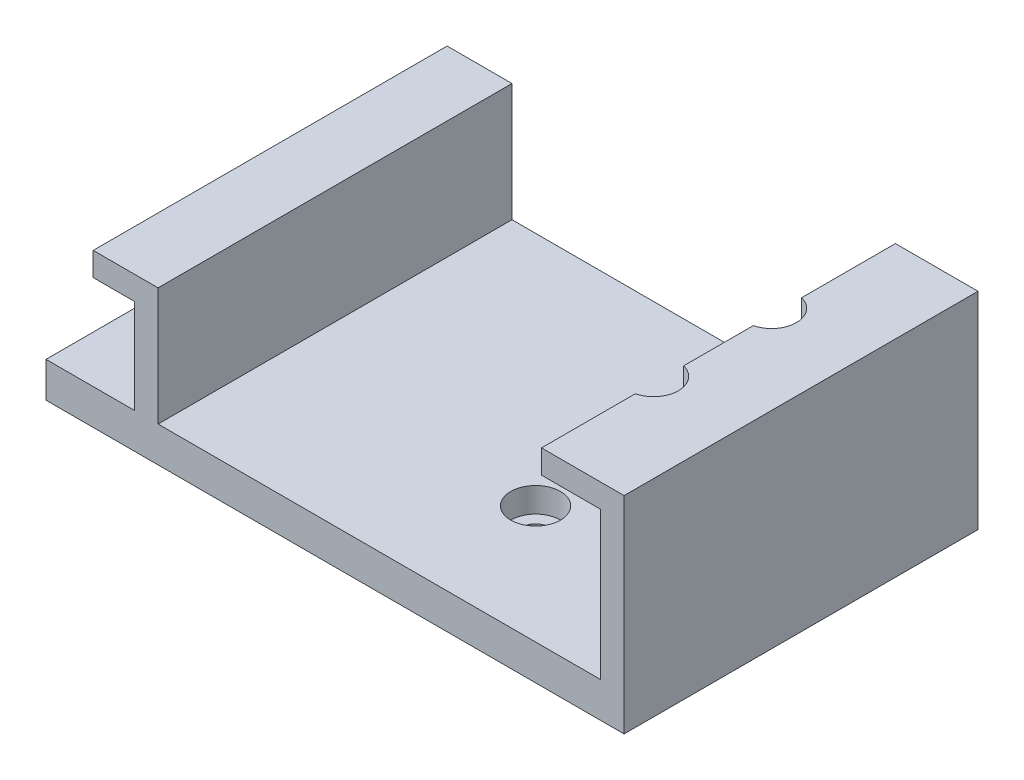
ISO-10303-21;
HEADER;
FILE_DESCRIPTION(('STEP AP214'),'2;1');
FILE_NAME('part.step','',(''),(''),'','','');
FILE_SCHEMA(('AUTOMOTIVE_DESIGN { 1 0 10303 214 1 1 1 1 }'));
ENDSEC;
DATA;
#1=APPLICATION_CONTEXT('core data for automotive mechanical design processes');
#2=APPLICATION_PROTOCOL_DEFINITION('international standard','automotive_design',2000,#1);
#3=PRODUCT_CONTEXT('',#1,'mechanical');
#4=PRODUCT('Part','Part','',(#3));
#5=PRODUCT_RELATED_PRODUCT_CATEGORY('part','',(#4));
#6=PRODUCT_DEFINITION_FORMATION('','',#4);
#7=PRODUCT_DEFINITION_CONTEXT('part definition',#1,'design');
#8=PRODUCT_DEFINITION('design','',#6,#7);
#9=PRODUCT_DEFINITION_SHAPE('','',#8);
#10=(LENGTH_UNIT() NAMED_UNIT(*) SI_UNIT(.MILLI.,.METRE.));
#11=(NAMED_UNIT(*) PLANE_ANGLE_UNIT() SI_UNIT($,.RADIAN.));
#12=(NAMED_UNIT(*) SI_UNIT($,.STERADIAN.) SOLID_ANGLE_UNIT());
#13=UNCERTAINTY_MEASURE_WITH_UNIT(LENGTH_MEASURE(1.E-05),#10,'distance_accuracy_value','');
#14=(GEOMETRIC_REPRESENTATION_CONTEXT(3) GLOBAL_UNCERTAINTY_ASSIGNED_CONTEXT((#13)) GLOBAL_UNIT_ASSIGNED_CONTEXT((#10,
#11,#12)) REPRESENTATION_CONTEXT('',''));
#15=CARTESIAN_POINT('',(0.,0.,0.));
#16=DIRECTION('',(0.,0.,1.));
#17=DIRECTION('',(1.,0.,0.));
#18=AXIS2_PLACEMENT_3D('',#15,#16,#17);
#19=CARTESIAN_POINT('',(-14.,-4.,30.));
#20=DIRECTION('',(1.,0.,0.));
#21=DIRECTION('',(0.,0.,-1.));
#22=AXIS2_PLACEMENT_3D('',#19,#20,#21);
#23=PLANE('',#22);
#24=DIRECTION('',(0.,-1.,0.));
#25=VECTOR('',#24,1.);
#26=CARTESIAN_POINT('',(-14.,11.,14.0946581053856));
#27=LINE('',#26,#25);
#28=CARTESIAN_POINT('',(-14.,-4.,14.0946581053856));
#29=VERTEX_POINT('',#28);
#30=CARTESIAN_POINT('',(-14.,0.,14.0946581053856));
#31=VERTEX_POINT('',#30);
#32=EDGE_CURVE('E432',#29,#31,#27,.F.);
#33=ORIENTED_EDGE('',*,*,#32,.F.);
#34=DIRECTION('',(0.,0.,-1.));
#35=VECTOR('',#34,1.);
#36=CARTESIAN_POINT('',(-14.,-4.,30.));
#37=LINE('',#36,#35);
#38=CARTESIAN_POINT('',(-14.,-4.,30.));
#39=VERTEX_POINT('',#38);
#40=EDGE_CURVE('E206',#39,#29,#37,.T.);
#41=ORIENTED_EDGE('',*,*,#40,.F.);
#42=DIRECTION('',(0.,-1.,0.));
#43=VECTOR('',#42,1.);
#44=CARTESIAN_POINT('',(-14.,-4.,30.));
#45=LINE('',#44,#43);
#46=CARTESIAN_POINT('',(-14.,0.,30.));
#47=VERTEX_POINT('',#46);
#48=EDGE_CURVE('E393',#47,#39,#45,.T.);
#49=ORIENTED_EDGE('',*,*,#48,.F.);
#50=DIRECTION('',(0.,0.,-1.));
#51=VECTOR('',#50,1.);
#52=CARTESIAN_POINT('',(-14.,0.,30.));
#53=LINE('',#52,#51);
#54=EDGE_CURVE('E226',#47,#31,#53,.T.);
#55=ORIENTED_EDGE('',*,*,#54,.T.);
#56=EDGE_LOOP('',(#33,#41,#49,#55));
#57=FACE_BOUND('',#56,.T.);
#58=ADVANCED_FACE('F33',(#57),#23,.F.);
#59=DIRECTION('',(0.,-1.,0.));
#60=VECTOR('',#59,1.);
#61=CARTESIAN_POINT('',(-14.,11.,5.90534189461441));
#62=LINE('',#61,#60);
#63=CARTESIAN_POINT('',(-14.,0.,5.90534189461441));
#64=VERTEX_POINT('',#63);
#65=CARTESIAN_POINT('',(-14.,-4.,5.90534189461441));
#66=VERTEX_POINT('',#65);
#67=EDGE_CURVE('E477',#64,#66,#62,.T.);
#68=ORIENTED_EDGE('',*,*,#67,.F.);
#69=CARTESIAN_POINT('',(-14.,0.,-5.90534189461441));
#70=VERTEX_POINT('',#69);
#71=EDGE_CURVE('E223',#64,#70,#53,.T.);
#72=ORIENTED_EDGE('',*,*,#71,.T.);
#73=DIRECTION('',(0.,-1.,0.));
#74=VECTOR('',#73,1.);
#75=CARTESIAN_POINT('',(-14.,11.,-5.90534189461441));
#76=LINE('',#75,#74);
#77=CARTESIAN_POINT('',(-14.,-4.,-5.90534189461441));
#78=VERTEX_POINT('',#77);
#79=EDGE_CURVE('E200',#78,#70,#76,.F.);
#80=ORIENTED_EDGE('',*,*,#79,.F.);
#81=EDGE_CURVE('E276',#66,#78,#37,.T.);
#82=ORIENTED_EDGE('',*,*,#81,.F.);
#83=EDGE_LOOP('',(#68,#72,#80,#82));
#84=FACE_BOUND('',#83,.T.);
#85=ADVANCED_FACE('F476',(#84),#23,.F.);
#86=DIRECTION('',(0.,-1.,0.));
#87=VECTOR('',#86,1.);
#88=CARTESIAN_POINT('',(-14.,11.,-14.0946581053856));
#89=LINE('',#88,#87);
#90=CARTESIAN_POINT('',(-14.,0.,-14.0946581053856));
#91=VERTEX_POINT('',#90);
#92=CARTESIAN_POINT('',(-14.,-4.,-14.0946581053856));
#93=VERTEX_POINT('',#92);
#94=EDGE_CURVE('E197',#91,#93,#89,.T.);
#95=ORIENTED_EDGE('',*,*,#94,.F.);
#96=CARTESIAN_POINT('',(-14.,0.,-30.));
#97=VERTEX_POINT('',#96);
#98=EDGE_CURVE('E212',#91,#97,#53,.T.);
#99=ORIENTED_EDGE('',*,*,#98,.T.);
#100=DIRECTION('',(0.,-1.,0.));
#101=VECTOR('',#100,1.);
#102=CARTESIAN_POINT('',(-14.,-4.,-30.));
#103=LINE('',#102,#101);
#104=CARTESIAN_POINT('',(-14.,-4.,-30.));
#105=VERTEX_POINT('',#104);
#106=EDGE_CURVE('E290',#97,#105,#103,.T.);
#107=ORIENTED_EDGE('',*,*,#106,.T.);
#108=EDGE_CURVE('E214',#93,#105,#37,.T.);
#109=ORIENTED_EDGE('',*,*,#108,.F.);
#110=EDGE_LOOP('',(#95,#99,#107,#109));
#111=FACE_BOUND('',#110,.T.);
#112=ADVANCED_FACE('F210',(#111),#23,.F.);
#113=CARTESIAN_POINT('',(-15.,-39.,10.));
#114=DIRECTION('',(0.,1.,0.));
#115=DIRECTION('',(0.,0.,1.));
#116=AXIS2_PLACEMENT_3D('',#113,#114,#115);
#117=CYLINDRICAL_SURFACE('',#116,2.2);
#118=CARTESIAN_POINT('',(-15.,-35.,10.));
#119=DIRECTION('',(0.,1.,0.));
#120=DIRECTION('',(-1.,0.,0.));
#121=AXIS2_PLACEMENT_3D('',#118,#119,#120);
#122=CIRCLE('',#121,2.2);
#123=CARTESIAN_POINT('',(-17.2,-35.,10.));
#124=VERTEX_POINT('',#123);
#125=EDGE_CURVE('E277',#124,#124,#122,.T.);
#126=ORIENTED_EDGE('',*,*,#125,.F.);
#127=EDGE_LOOP('',(#126));
#128=FACE_BOUND('',#127,.T.);
#129=CARTESIAN_POINT('',(-15.,-33.2,10.));
#130=DIRECTION('',(0.,1.,0.));
#131=DIRECTION('',(0.,0.,1.));
#132=AXIS2_PLACEMENT_3D('',#129,#130,#131);
#133=CIRCLE('',#132,2.2);
#134=CARTESIAN_POINT('',(-15.,-33.2,12.2));
#135=VERTEX_POINT('',#134);
#136=EDGE_CURVE('E215',#135,#135,#133,.F.);
#137=ORIENTED_EDGE('',*,*,#136,.F.);
#138=EDGE_LOOP('',(#137));
#139=FACE_BOUND('',#138,.T.);
#140=ADVANCED_FACE('F526',(#128,#139),#117,.F.);
#141=CARTESIAN_POINT('',(-15.,-39.,-10.));
#142=DIRECTION('',(0.,1.,0.));
#143=DIRECTION('',(0.,0.,1.));
#144=AXIS2_PLACEMENT_3D('',#141,#142,#143);
#145=CYLINDRICAL_SURFACE('',#144,2.2);
#146=CARTESIAN_POINT('',(-15.,-35.,-10.));
#147=DIRECTION('',(0.,1.,0.));
#148=DIRECTION('',(-1.,0.,0.));
#149=AXIS2_PLACEMENT_3D('',#146,#147,#148);
#150=CIRCLE('',#149,2.2);
#151=CARTESIAN_POINT('',(-17.2,-35.,-10.));
#152=VERTEX_POINT('',#151);
#153=EDGE_CURVE('E280',#152,#152,#150,.T.);
#154=ORIENTED_EDGE('',*,*,#153,.F.);
#155=EDGE_LOOP('',(#154));
#156=FACE_BOUND('',#155,.T.);
#157=CARTESIAN_POINT('',(-15.,-33.2,-10.));
#158=DIRECTION('',(0.,1.,0.));
#159=DIRECTION('',(0.,0.,1.));
#160=AXIS2_PLACEMENT_3D('',#157,#158,#159);
#161=CIRCLE('',#160,2.2);
#162=CARTESIAN_POINT('',(-15.,-33.2,-7.8));
#163=VERTEX_POINT('',#162);
#164=EDGE_CURVE('E298',#163,#163,#161,.F.);
#165=ORIENTED_EDGE('',*,*,#164,.F.);
#166=EDGE_LOOP('',(#165));
#167=FACE_BOUND('',#166,.T.);
#168=ADVANCED_FACE('F530',(#156,#167),#145,.F.);
#169=CARTESIAN_POINT('',(-35.,-39.,-10.));
#170=DIRECTION('',(0.,1.,0.));
#171=DIRECTION('',(0.,0.,1.));
#172=AXIS2_PLACEMENT_3D('',#169,#170,#171);
#173=CYLINDRICAL_SURFACE('',#172,2.2);
#174=CARTESIAN_POINT('',(-35.,-35.,-10.));
#175=DIRECTION('',(0.,1.,0.));
#176=DIRECTION('',(-1.,0.,0.));
#177=AXIS2_PLACEMENT_3D('',#174,#175,#176);
#178=CIRCLE('',#177,2.2);
#179=CARTESIAN_POINT('',(-37.2,-35.,-10.));
#180=VERTEX_POINT('',#179);
#181=EDGE_CURVE('E284',#180,#180,#178,.T.);
#182=ORIENTED_EDGE('',*,*,#181,.F.);
#183=EDGE_LOOP('',(#182));
#184=FACE_BOUND('',#183,.T.);
#185=CARTESIAN_POINT('',(-35.,-33.2,-10.));
#186=DIRECTION('',(0.,1.,0.));
#187=DIRECTION('',(0.,0.,1.));
#188=AXIS2_PLACEMENT_3D('',#185,#186,#187);
#189=CIRCLE('',#188,2.2);
#190=CARTESIAN_POINT('',(-35.,-33.2,-7.80000000000001));
#191=VERTEX_POINT('',#190);
#192=EDGE_CURVE('E294',#191,#191,#189,.F.);
#193=ORIENTED_EDGE('',*,*,#192,.F.);
#194=EDGE_LOOP('',(#193));
#195=FACE_BOUND('',#194,.T.);
#196=ADVANCED_FACE('F536',(#184,#195),#173,.F.);
#197=CARTESIAN_POINT('',(-35.,-39.,10.));
#198=DIRECTION('',(0.,1.,0.));
#199=DIRECTION('',(0.,0.,1.));
#200=AXIS2_PLACEMENT_3D('',#197,#198,#199);
#201=CYLINDRICAL_SURFACE('',#200,2.2);
#202=CARTESIAN_POINT('',(-35.,-35.,10.));
#203=DIRECTION('',(0.,1.,0.));
#204=DIRECTION('',(-1.,0.,0.));
#205=AXIS2_PLACEMENT_3D('',#202,#203,#204);
#206=CIRCLE('',#205,2.2);
#207=CARTESIAN_POINT('',(-37.2,-35.,10.));
#208=VERTEX_POINT('',#207);
#209=EDGE_CURVE('E287',#208,#208,#206,.T.);
#210=ORIENTED_EDGE('',*,*,#209,.F.);
#211=EDGE_LOOP('',(#210));
#212=FACE_BOUND('',#211,.T.);
#213=CARTESIAN_POINT('',(-35.,-33.2,10.));
#214=DIRECTION('',(0.,1.,0.));
#215=DIRECTION('',(0.,0.,1.));
#216=AXIS2_PLACEMENT_3D('',#213,#214,#215);
#217=CIRCLE('',#216,2.2);
#218=CARTESIAN_POINT('',(-35.,-33.2,12.2));
#219=VERTEX_POINT('',#218);
#220=EDGE_CURVE('E291',#219,#219,#217,.F.);
#221=ORIENTED_EDGE('',*,*,#220,.F.);
#222=EDGE_LOOP('',(#221));
#223=FACE_BOUND('',#222,.T.);
#224=ADVANCED_FACE('F542',(#212,#223),#201,.F.);
#225=CARTESIAN_POINT('',(-4.,-4.,30.));
#226=DIRECTION('',(0.,1.,0.));
#227=DIRECTION('',(-1.,0.,0.));
#228=AXIS2_PLACEMENT_3D('',#225,#226,#227);
#229=PLANE('',#228);
#230=CARTESIAN_POINT('',(-15.,-4.,10.));
#231=DIRECTION('',(0.,1.,0.));
#232=DIRECTION('',(-1.,0.,0.));
#233=AXIS2_PLACEMENT_3D('',#230,#231,#232);
#234=CIRCLE('',#233,4.215);
#235=EDGE_CURVE('E437',#66,#29,#234,.F.);
#236=ORIENTED_EDGE('',*,*,#235,.F.);
#237=ORIENTED_EDGE('',*,*,#81,.T.);
#238=CARTESIAN_POINT('',(-15.,-4.,-10.));
#239=DIRECTION('',(0.,1.,0.));
#240=DIRECTION('',(-1.,0.,0.));
#241=AXIS2_PLACEMENT_3D('',#238,#239,#240);
#242=CIRCLE('',#241,4.215);
#243=EDGE_CURVE('E473',#93,#78,#242,.F.);
#244=ORIENTED_EDGE('',*,*,#243,.F.);
#245=ORIENTED_EDGE('',*,*,#108,.T.);
#246=DIRECTION('',(1.,0.,0.));
#247=VECTOR('',#246,1.);
#248=CARTESIAN_POINT('',(-4.,-4.,-30.));
#249=LINE('',#248,#247);
#250=CARTESIAN_POINT('',(-4.,-4.,-30.));
#251=VERTEX_POINT('',#250);
#252=EDGE_CURVE('E369',#105,#251,#249,.T.);
#253=ORIENTED_EDGE('',*,*,#252,.T.);
#254=DIRECTION('',(0.,0.,-1.));
#255=VECTOR('',#254,1.);
#256=CARTESIAN_POINT('',(-4.,-4.,30.));
#257=LINE('',#256,#255);
#258=CARTESIAN_POINT('',(-4.,-4.,30.));
#259=VERTEX_POINT('',#258);
#260=EDGE_CURVE('E271',#259,#251,#257,.T.);
#261=ORIENTED_EDGE('',*,*,#260,.F.);
#262=DIRECTION('',(1.,0.,0.));
#263=VECTOR('',#262,1.);
#264=CARTESIAN_POINT('',(-4.,-4.,30.));
#265=LINE('',#264,#263);
#266=EDGE_CURVE('E395',#39,#259,#265,.T.);
#267=ORIENTED_EDGE('',*,*,#266,.F.);
#268=ORIENTED_EDGE('',*,*,#40,.T.);
#269=EDGE_LOOP('',(#236,#237,#244,#245,#253,#261,#267,#268));
#270=FACE_BOUND('',#269,.T.);
#271=ADVANCED_FACE('F435',(#270),#229,.F.);
#272=CARTESIAN_POINT('',(-4.,-29.,30.));
#273=DIRECTION('',(1.,0.,0.));
#274=DIRECTION('',(0.,0.,-1.));
#275=AXIS2_PLACEMENT_3D('',#272,#273,#274);
#276=PLANE('',#275);
#277=DIRECTION('',(0.,-1.,0.));
#278=VECTOR('',#277,1.);
#279=CARTESIAN_POINT('',(-4.,-29.,-30.));
#280=LINE('',#279,#278);
#281=CARTESIAN_POINT('',(-4.,-29.,-30.));
#282=VERTEX_POINT('',#281);
#283=EDGE_CURVE('E371',#251,#282,#280,.T.);
#284=ORIENTED_EDGE('',*,*,#283,.T.);
#285=DIRECTION('',(0.,0.,-1.));
#286=VECTOR('',#285,1.);
#287=CARTESIAN_POINT('',(-4.,-29.,30.));
#288=LINE('',#287,#286);
#289=CARTESIAN_POINT('',(-4.,-29.,30.));
#290=VERTEX_POINT('',#289);
#291=EDGE_CURVE('E268',#290,#282,#288,.T.);
#292=ORIENTED_EDGE('',*,*,#291,.F.);
#293=DIRECTION('',(0.,-1.,0.));
#294=VECTOR('',#293,1.);
#295=CARTESIAN_POINT('',(-4.,-29.,30.));
#296=LINE('',#295,#294);
#297=EDGE_CURVE('E398',#259,#290,#296,.T.);
#298=ORIENTED_EDGE('',*,*,#297,.F.);
#299=ORIENTED_EDGE('',*,*,#260,.T.);
#300=EDGE_LOOP('',(#284,#292,#298,#299));
#301=FACE_BOUND('',#300,.T.);
#302=ADVANCED_FACE('F445',(#301),#276,.F.);
#303=CARTESIAN_POINT('',(-79.,-29.,30.));
#304=DIRECTION('',(0.,-1.,0.));
#305=DIRECTION('',(1.,0.,0.));
#306=AXIS2_PLACEMENT_3D('',#303,#304,#305);
#307=PLANE('',#306);
#308=CARTESIAN_POINT('',(-35.,-29.,10.));
#309=DIRECTION('',(0.,-1.,0.));
#310=DIRECTION('',(1.,0.,0.));
#311=AXIS2_PLACEMENT_3D('',#308,#309,#310);
#312=CIRCLE('',#311,4.215);
#313=CARTESIAN_POINT('',(-30.785,-29.,10.));
#314=VERTEX_POINT('',#313);
#315=EDGE_CURVE('E281',#314,#314,#312,.F.);
#316=ORIENTED_EDGE('',*,*,#315,.F.);
#317=EDGE_LOOP('',(#316));
#318=FACE_BOUND('',#317,.T.);
#319=CARTESIAN_POINT('',(-15.,-29.,10.));
#320=DIRECTION('',(0.,-1.,0.));
#321=DIRECTION('',(1.,0.,0.));
#322=AXIS2_PLACEMENT_3D('',#319,#320,#321);
#323=CIRCLE('',#322,4.215);
#324=CARTESIAN_POINT('',(-10.785,-29.,10.));
#325=VERTEX_POINT('',#324);
#326=EDGE_CURVE('E308',#325,#325,#323,.F.);
#327=ORIENTED_EDGE('',*,*,#326,.F.);
#328=EDGE_LOOP('',(#327));
#329=FACE_BOUND('',#328,.T.);
#330=CARTESIAN_POINT('',(-15.,-29.,-10.));
#331=DIRECTION('',(0.,-1.,0.));
#332=DIRECTION('',(1.,0.,0.));
#333=AXIS2_PLACEMENT_3D('',#330,#331,#332);
#334=CIRCLE('',#333,4.215);
#335=CARTESIAN_POINT('',(-10.785,-29.,-10.));
#336=VERTEX_POINT('',#335);
#337=EDGE_CURVE('E479',#336,#336,#334,.F.);
#338=ORIENTED_EDGE('',*,*,#337,.F.);
#339=EDGE_LOOP('',(#338));
#340=FACE_BOUND('',#339,.T.);
#341=CARTESIAN_POINT('',(-35.,-29.,-10.));
#342=DIRECTION('',(0.,-1.,0.));
#343=DIRECTION('',(1.,0.,0.));
#344=AXIS2_PLACEMENT_3D('',#341,#342,#343);
#345=CIRCLE('',#344,4.215);
#346=CARTESIAN_POINT('',(-30.785,-29.,-10.));
#347=VERTEX_POINT('',#346);
#348=EDGE_CURVE('E305',#347,#347,#345,.F.);
#349=ORIENTED_EDGE('',*,*,#348,.F.);
#350=EDGE_LOOP('',(#349));
#351=FACE_BOUND('',#350,.T.);
#352=DIRECTION('',(-1.,0.,0.));
#353=VECTOR('',#352,1.);
#354=CARTESIAN_POINT('',(-79.,-29.,-30.));
#355=LINE('',#354,#353);
#356=CARTESIAN_POINT('',(-79.,-29.,-30.));
#357=VERTEX_POINT('',#356);
#358=EDGE_CURVE('E373',#282,#357,#355,.T.);
#359=ORIENTED_EDGE('',*,*,#358,.T.);
#360=DIRECTION('',(0.,0.,-1.));
#361=VECTOR('',#360,1.);
#362=CARTESIAN_POINT('',(-79.,-29.,30.));
#363=LINE('',#362,#361);
#364=CARTESIAN_POINT('',(-79.,-29.,30.));
#365=VERTEX_POINT('',#364);
#366=EDGE_CURVE('E265',#365,#357,#363,.T.);
#367=ORIENTED_EDGE('',*,*,#366,.F.);
#368=DIRECTION('',(-1.,0.,0.));
#369=VECTOR('',#368,1.);
#370=CARTESIAN_POINT('',(-79.,-29.,30.));
#371=LINE('',#370,#369);
#372=EDGE_CURVE('E404',#290,#365,#371,.T.);
#373=ORIENTED_EDGE('',*,*,#372,.F.);
#374=ORIENTED_EDGE('',*,*,#291,.T.);
#375=EDGE_LOOP('',(#359,#367,#373,#374));
#376=FACE_BOUND('',#375,.T.);
#377=ADVANCED_FACE('F449',(#318,#329,#340,#351,#376),#307,.F.);
#378=CARTESIAN_POINT('',(-79.,-9.00000000000002,30.));
#379=DIRECTION('',(-1.,0.,0.));
#380=DIRECTION('',(0.,0.,1.));
#381=AXIS2_PLACEMENT_3D('',#378,#379,#380);
#382=PLANE('',#381);
#383=DIRECTION('',(0.,1.,0.));
#384=VECTOR('',#383,1.);
#385=CARTESIAN_POINT('',(-79.,-9.00000000000002,-30.));
#386=LINE('',#385,#384);
#387=CARTESIAN_POINT('',(-79.,-9.00000000000002,-30.));
#388=VERTEX_POINT('',#387);
#389=EDGE_CURVE('E375',#357,#388,#386,.T.);
#390=ORIENTED_EDGE('',*,*,#389,.T.);
#391=DIRECTION('',(0.,0.,-1.));
#392=VECTOR('',#391,1.);
#393=CARTESIAN_POINT('',(-79.,-9.00000000000002,30.));
#394=LINE('',#393,#392);
#395=CARTESIAN_POINT('',(-79.,-9.00000000000002,30.));
#396=VERTEX_POINT('',#395);
#397=EDGE_CURVE('E262',#396,#388,#394,.T.);
#398=ORIENTED_EDGE('',*,*,#397,.F.);
#399=DIRECTION('',(0.,1.,0.));
#400=VECTOR('',#399,1.);
#401=CARTESIAN_POINT('',(-79.,-9.00000000000002,30.));
#402=LINE('',#401,#400);
#403=EDGE_CURVE('E406',#365,#396,#402,.T.);
#404=ORIENTED_EDGE('',*,*,#403,.F.);
#405=ORIENTED_EDGE('',*,*,#366,.T.);
#406=EDGE_LOOP('',(#390,#398,#404,#405));
#407=FACE_BOUND('',#406,.T.);
#408=ADVANCED_FACE('F454',(#407),#382,.F.);
#409=CARTESIAN_POINT('',(-90.,-9.00000000000002,30.));
#410=DIRECTION('',(0.,-1.,0.));
#411=DIRECTION('',(0.,0.,-1.));
#412=AXIS2_PLACEMENT_3D('',#409,#410,#411);
#413=PLANE('',#412);
#414=DIRECTION('',(-1.,0.,0.));
#415=VECTOR('',#414,1.);
#416=CARTESIAN_POINT('',(-90.,-9.00000000000002,-30.));
#417=LINE('',#416,#415);
#418=CARTESIAN_POINT('',(-90.,-9.00000000000002,-30.));
#419=VERTEX_POINT('',#418);
#420=EDGE_CURVE('E377',#388,#419,#417,.T.);
#421=ORIENTED_EDGE('',*,*,#420,.T.);
#422=DIRECTION('',(0.,0.,-1.));
#423=VECTOR('',#422,1.);
#424=CARTESIAN_POINT('',(-90.,-9.00000000000002,30.));
#425=LINE('',#424,#423);
#426=CARTESIAN_POINT('',(-90.,-9.00000000000002,30.));
#427=VERTEX_POINT('',#426);
#428=EDGE_CURVE('E259',#427,#419,#425,.T.);
#429=ORIENTED_EDGE('',*,*,#428,.F.);
#430=DIRECTION('',(-1.,0.,0.));
#431=VECTOR('',#430,1.);
#432=CARTESIAN_POINT('',(-90.,-9.00000000000002,30.));
#433=LINE('',#432,#431);
#434=EDGE_CURVE('E408',#396,#427,#433,.T.);
#435=ORIENTED_EDGE('',*,*,#434,.F.);
#436=ORIENTED_EDGE('',*,*,#397,.T.);
#437=EDGE_LOOP('',(#421,#429,#435,#436));
#438=FACE_BOUND('',#437,.T.);
#439=ADVANCED_FACE('F460',(#438),#413,.F.);
#440=CARTESIAN_POINT('',(-90.,-13.,30.));
#441=DIRECTION('',(1.,0.,0.));
#442=DIRECTION('',(0.,0.,-1.));
#443=AXIS2_PLACEMENT_3D('',#440,#441,#442);
#444=PLANE('',#443);
#445=DIRECTION('',(0.,-1.,0.));
#446=VECTOR('',#445,1.);
#447=CARTESIAN_POINT('',(-90.,-13.,-30.));
#448=LINE('',#447,#446);
#449=CARTESIAN_POINT('',(-90.,-13.,-30.));
#450=VERTEX_POINT('',#449);
#451=EDGE_CURVE('E379',#419,#450,#448,.T.);
#452=ORIENTED_EDGE('',*,*,#451,.T.);
#453=DIRECTION('',(0.,0.,-1.));
#454=VECTOR('',#453,1.);
#455=CARTESIAN_POINT('',(-90.,-13.,30.));
#456=LINE('',#455,#454);
#457=CARTESIAN_POINT('',(-90.,-13.,30.));
#458=VERTEX_POINT('',#457);
#459=EDGE_CURVE('E256',#458,#450,#456,.T.);
#460=ORIENTED_EDGE('',*,*,#459,.F.);
#461=DIRECTION('',(0.,-1.,0.));
#462=VECTOR('',#461,1.);
#463=CARTESIAN_POINT('',(-90.,-13.,30.));
#464=LINE('',#463,#462);
#465=EDGE_CURVE('E410',#427,#458,#464,.T.);
#466=ORIENTED_EDGE('',*,*,#465,.F.);
#467=ORIENTED_EDGE('',*,*,#428,.T.);
#468=EDGE_LOOP('',(#452,#460,#466,#467));
#469=FACE_BOUND('',#468,.T.);
#470=ADVANCED_FACE('F464',(#469),#444,.F.);
#471=CARTESIAN_POINT('',(-83.,-13.,30.));
#472=DIRECTION('',(0.,1.,0.));
#473=DIRECTION('',(-1.,0.,0.));
#474=AXIS2_PLACEMENT_3D('',#471,#472,#473);
#475=PLANE('',#474);
#476=DIRECTION('',(1.,0.,0.));
#477=VECTOR('',#476,1.);
#478=CARTESIAN_POINT('',(-83.,-13.,-30.));
#479=LINE('',#478,#477);
#480=CARTESIAN_POINT('',(-83.,-13.,-30.));
#481=VERTEX_POINT('',#480);
#482=EDGE_CURVE('E381',#450,#481,#479,.T.);
#483=ORIENTED_EDGE('',*,*,#482,.T.);
#484=DIRECTION('',(0.,0.,-1.));
#485=VECTOR('',#484,1.);
#486=CARTESIAN_POINT('',(-83.,-13.,30.));
#487=LINE('',#486,#485);
#488=CARTESIAN_POINT('',(-83.,-13.,30.));
#489=VERTEX_POINT('',#488);
#490=EDGE_CURVE('E253',#489,#481,#487,.T.);
#491=ORIENTED_EDGE('',*,*,#490,.F.);
#492=DIRECTION('',(1.,0.,0.));
#493=VECTOR('',#492,1.);
#494=CARTESIAN_POINT('',(-83.,-13.,30.));
#495=LINE('',#494,#493);
#496=EDGE_CURVE('E412',#458,#489,#495,.T.);
#497=ORIENTED_EDGE('',*,*,#496,.F.);
#498=ORIENTED_EDGE('',*,*,#459,.T.);
#499=EDGE_LOOP('',(#483,#491,#497,#498));
#500=FACE_BOUND('',#499,.T.);
#501=ADVANCED_FACE('F469',(#500),#475,.F.);
#502=CARTESIAN_POINT('',(-83.,-29.,30.));
#503=DIRECTION('',(1.,0.,0.));
#504=DIRECTION('',(0.,0.,-1.));
#505=AXIS2_PLACEMENT_3D('',#502,#503,#504);
#506=PLANE('',#505);
#507=DIRECTION('',(0.,-1.,0.));
#508=VECTOR('',#507,1.);
#509=CARTESIAN_POINT('',(-83.,-29.,-30.));
#510=LINE('',#509,#508);
#511=CARTESIAN_POINT('',(-83.,-29.,-30.));
#512=VERTEX_POINT('',#511);
#513=EDGE_CURVE('E383',#481,#512,#510,.T.);
#514=ORIENTED_EDGE('',*,*,#513,.T.);
#515=DIRECTION('',(0.,0.,-1.));
#516=VECTOR('',#515,1.);
#517=CARTESIAN_POINT('',(-83.,-29.,30.));
#518=LINE('',#517,#516);
#519=CARTESIAN_POINT('',(-83.,-29.,30.));
#520=VERTEX_POINT('',#519);
#521=EDGE_CURVE('E250',#520,#512,#518,.T.);
#522=ORIENTED_EDGE('',*,*,#521,.F.);
#523=DIRECTION('',(0.,-1.,0.));
#524=VECTOR('',#523,1.);
#525=CARTESIAN_POINT('',(-83.,-29.,30.));
#526=LINE('',#525,#524);
#527=EDGE_CURVE('E414',#489,#520,#526,.T.);
#528=ORIENTED_EDGE('',*,*,#527,.F.);
#529=ORIENTED_EDGE('',*,*,#490,.T.);
#530=EDGE_LOOP('',(#514,#522,#528,#529));
#531=FACE_BOUND('',#530,.T.);
#532=ADVANCED_FACE('F471',(#531),#506,.F.);
#533=CARTESIAN_POINT('',(-98.,-29.,30.));
#534=DIRECTION('',(0.,-1.,0.));
#535=DIRECTION('',(1.,0.,0.));
#536=AXIS2_PLACEMENT_3D('',#533,#534,#535);
#537=PLANE('',#536);
#538=DIRECTION('',(-1.,0.,0.));
#539=VECTOR('',#538,1.);
#540=CARTESIAN_POINT('',(-98.,-29.,-30.));
#541=LINE('',#540,#539);
#542=CARTESIAN_POINT('',(-98.,-29.,-30.));
#543=VERTEX_POINT('',#542);
#544=EDGE_CURVE('E385',#512,#543,#541,.T.);
#545=ORIENTED_EDGE('',*,*,#544,.T.);
#546=DIRECTION('',(0.,0.,-1.));
#547=VECTOR('',#546,1.);
#548=CARTESIAN_POINT('',(-98.,-29.,30.));
#549=LINE('',#548,#547);
#550=CARTESIAN_POINT('',(-98.,-29.,30.));
#551=VERTEX_POINT('',#550);
#552=EDGE_CURVE('E247',#551,#543,#549,.T.);
#553=ORIENTED_EDGE('',*,*,#552,.F.);
#554=DIRECTION('',(-1.,0.,0.));
#555=VECTOR('',#554,1.);
#556=CARTESIAN_POINT('',(-98.,-29.,30.));
#557=LINE('',#556,#555);
#558=EDGE_CURVE('E364',#520,#551,#557,.T.);
#559=ORIENTED_EDGE('',*,*,#558,.F.);
#560=ORIENTED_EDGE('',*,*,#521,.T.);
#561=EDGE_LOOP('',(#545,#553,#559,#560));
#562=FACE_BOUND('',#561,.T.);
#563=ADVANCED_FACE('F421',(#562),#537,.F.);
#564=CARTESIAN_POINT('',(-98.,-35.,30.));
#565=DIRECTION('',(1.,0.,0.));
#566=DIRECTION('',(0.,0.,-1.));
#567=AXIS2_PLACEMENT_3D('',#564,#565,#566);
#568=PLANE('',#567);
#569=CARTESIAN_POINT('',(-98.,-35.,17.));
#570=DIRECTION('',(1.,0.,0.));
#571=DIRECTION('',(0.,0.,-1.));
#572=AXIS2_PLACEMENT_3D('',#569,#570,#571);
#573=CIRCLE('',#572,3.);
#574=CARTESIAN_POINT('',(-98.,-32.,17.));
#575=VERTEX_POINT('',#574);
#576=CARTESIAN_POINT('',(-98.,-33.5,19.5980762113533));
#577=VERTEX_POINT('',#576);
#578=EDGE_CURVE('E319',#575,#577,#573,.T.);
#579=ORIENTED_EDGE('',*,*,#578,.T.);
#580=CARTESIAN_POINT('',(-98.,-32.,22.1961524227066));
#581=DIRECTION('',(1.,0.,0.));
#582=DIRECTION('',(0.,0.,-1.));
#583=AXIS2_PLACEMENT_3D('',#580,#581,#582);
#584=CIRCLE('',#583,3.);
#585=CARTESIAN_POINT('',(-98.,-35.,22.1961524227066));
#586=VERTEX_POINT('',#585);
#587=EDGE_CURVE('E329',#577,#586,#584,.F.);
#588=ORIENTED_EDGE('',*,*,#587,.T.);
#589=DIRECTION('',(0.,0.,-1.));
#590=VECTOR('',#589,1.);
#591=CARTESIAN_POINT('',(-98.,-35.,30.));
#592=LINE('',#591,#590);
#593=CARTESIAN_POINT('',(-98.,-35.,30.));
#594=VERTEX_POINT('',#593);
#595=EDGE_CURVE('E244',#594,#586,#592,.T.);
#596=ORIENTED_EDGE('',*,*,#595,.F.);
#597=DIRECTION('',(0.,-1.,0.));
#598=VECTOR('',#597,1.);
#599=CARTESIAN_POINT('',(-98.,-35.,30.));
#600=LINE('',#599,#598);
#601=EDGE_CURVE('E361',#551,#594,#600,.T.);
#602=ORIENTED_EDGE('',*,*,#601,.F.);
#603=ORIENTED_EDGE('',*,*,#552,.T.);
#604=DIRECTION('',(0.,-1.,0.));
#605=VECTOR('',#604,1.);
#606=CARTESIAN_POINT('',(-98.,-35.,-30.));
#607=LINE('',#606,#605);
#608=CARTESIAN_POINT('',(-98.,-35.,-30.));
#609=VERTEX_POINT('',#608);
#610=EDGE_CURVE('E387',#543,#609,#607,.T.);
#611=ORIENTED_EDGE('',*,*,#610,.T.);
#612=CARTESIAN_POINT('',(-98.,-35.,-22.1961524227066));
#613=VERTEX_POINT('',#612);
#614=EDGE_CURVE('E241',#613,#609,#592,.T.);
#615=ORIENTED_EDGE('',*,*,#614,.F.);
#616=CARTESIAN_POINT('',(-98.,-32.,-22.1961524227066));
#617=DIRECTION('',(1.,0.,0.));
#618=DIRECTION('',(0.,0.,-1.));
#619=AXIS2_PLACEMENT_3D('',#616,#617,#618);
#620=CIRCLE('',#619,3.);
#621=CARTESIAN_POINT('',(-98.,-33.5,-19.5980762113533));
#622=VERTEX_POINT('',#621);
#623=EDGE_CURVE('E327',#613,#622,#620,.F.);
#624=ORIENTED_EDGE('',*,*,#623,.T.);
#625=CARTESIAN_POINT('',(-98.,-35.,-17.));
#626=DIRECTION('',(1.,0.,0.));
#627=DIRECTION('',(0.,0.,-1.));
#628=AXIS2_PLACEMENT_3D('',#625,#626,#627);
#629=CIRCLE('',#628,3.);
#630=CARTESIAN_POINT('',(-98.,-32.,-17.));
#631=VERTEX_POINT('',#630);
#632=EDGE_CURVE('E322',#622,#631,#629,.T.);
#633=ORIENTED_EDGE('',*,*,#632,.T.);
#634=DIRECTION('',(0.,0.,-1.));
#635=VECTOR('',#634,1.);
#636=CARTESIAN_POINT('',(-98.,-32.,20.));
#637=LINE('',#636,#635);
#638=EDGE_CURVE('E632',#575,#631,#637,.T.);
#639=ORIENTED_EDGE('',*,*,#638,.F.);
#640=EDGE_LOOP('',(#579,#588,#596,#602,#603,#611,#615,#624,#633,#639));
#641=FACE_BOUND('',#640,.T.);
#642=ADVANCED_FACE('F350',(#641),#568,.F.);
#643=CARTESIAN_POINT('',(0.,-35.,30.));
#644=DIRECTION('',(0.,1.,0.));
#645=DIRECTION('',(-1.,0.,0.));
#646=AXIS2_PLACEMENT_3D('',#643,#644,#645);
#647=PLANE('',#646);
#648=ORIENTED_EDGE('',*,*,#595,.T.);
#649=DIRECTION('',(1.,0.,0.));
#650=VECTOR('',#649,1.);
#651=CARTESIAN_POINT('',(0.,-35.,22.1961524227066));
#652=LINE('',#651,#650);
#653=CARTESIAN_POINT('',(-53.,-35.,22.1961524227066));
#654=VERTEX_POINT('',#653);
#655=EDGE_CURVE('E334',#586,#654,#652,.T.);
#656=ORIENTED_EDGE('',*,*,#655,.T.);
#657=DIRECTION('',(0.,0.,1.));
#658=VECTOR('',#657,1.);
#659=CARTESIAN_POINT('',(-53.,-35.,20.));
#660=LINE('',#659,#658);
#661=CARTESIAN_POINT('',(-53.,-35.,-22.1961524227066));
#662=VERTEX_POINT('',#661);
#663=EDGE_CURVE('E55',#662,#654,#660,.T.);
#664=ORIENTED_EDGE('',*,*,#663,.F.);
#665=DIRECTION('',(1.,0.,0.));
#666=VECTOR('',#665,1.);
#667=CARTESIAN_POINT('',(0.,-35.,-22.1961524227066));
#668=LINE('',#667,#666);
#669=EDGE_CURVE('E331',#662,#613,#668,.F.);
#670=ORIENTED_EDGE('',*,*,#669,.T.);
#671=ORIENTED_EDGE('',*,*,#614,.T.);
#672=DIRECTION('',(1.,0.,0.));
#673=VECTOR('',#672,1.);
#674=CARTESIAN_POINT('',(0.,-35.,-30.));
#675=LINE('',#674,#673);
#676=CARTESIAN_POINT('',(0.,-35.,-30.));
#677=VERTEX_POINT('',#676);
#678=EDGE_CURVE('E390',#609,#677,#675,.T.);
#679=ORIENTED_EDGE('',*,*,#678,.T.);
#680=DIRECTION('',(0.,0.,-1.));
#681=VECTOR('',#680,1.);
#682=CARTESIAN_POINT('',(0.,-35.,30.));
#683=LINE('',#682,#681);
#684=CARTESIAN_POINT('',(0.,-35.,30.));
#685=VERTEX_POINT('',#684);
#686=EDGE_CURVE('E237',#685,#677,#683,.T.);
#687=ORIENTED_EDGE('',*,*,#686,.F.);
#688=DIRECTION('',(1.,0.,0.));
#689=VECTOR('',#688,1.);
#690=CARTESIAN_POINT('',(0.,-35.,30.));
#691=LINE('',#690,#689);
#692=EDGE_CURVE('E358',#594,#685,#691,.T.);
#693=ORIENTED_EDGE('',*,*,#692,.F.);
#694=EDGE_LOOP('',(#648,#656,#664,#670,#671,#679,#687,#693));
#695=FACE_BOUND('',#694,.T.);
#696=ORIENTED_EDGE('',*,*,#209,.T.);
#697=EDGE_LOOP('',(#696));
#698=FACE_BOUND('',#697,.T.);
#699=ORIENTED_EDGE('',*,*,#181,.T.);
#700=EDGE_LOOP('',(#699));
#701=FACE_BOUND('',#700,.T.);
#702=ORIENTED_EDGE('',*,*,#153,.T.);
#703=EDGE_LOOP('',(#702));
#704=FACE_BOUND('',#703,.T.);
#705=ORIENTED_EDGE('',*,*,#125,.T.);
#706=EDGE_LOOP('',(#705));
#707=FACE_BOUND('',#706,.T.);
#708=ADVANCED_FACE('F355',(#695,#698,#701,#704,#707),#647,.F.);
#709=CARTESIAN_POINT('',(0.,0.,30.));
#710=DIRECTION('',(-1.,0.,0.));
#711=DIRECTION('',(0.,-1.,0.));
#712=AXIS2_PLACEMENT_3D('',#709,#710,#711);
#713=PLANE('',#712);
#714=DIRECTION('',(0.,1.,0.));
#715=VECTOR('',#714,1.);
#716=CARTESIAN_POINT('',(0.,0.,-30.));
#717=LINE('',#716,#715);
#718=CARTESIAN_POINT('',(0.,0.,-30.));
#719=VERTEX_POINT('',#718);
#720=EDGE_CURVE('E392',#677,#719,#717,.T.);
#721=ORIENTED_EDGE('',*,*,#720,.T.);
#722=DIRECTION('',(0.,0.,-1.));
#723=VECTOR('',#722,1.);
#724=CARTESIAN_POINT('',(0.,0.,30.));
#725=LINE('',#724,#723);
#726=CARTESIAN_POINT('',(0.,0.,30.));
#727=VERTEX_POINT('',#726);
#728=EDGE_CURVE('E232',#727,#719,#725,.T.);
#729=ORIENTED_EDGE('',*,*,#728,.F.);
#730=DIRECTION('',(0.,1.,0.));
#731=VECTOR('',#730,1.);
#732=CARTESIAN_POINT('',(0.,0.,30.));
#733=LINE('',#732,#731);
#734=EDGE_CURVE('E227',#685,#727,#733,.T.);
#735=ORIENTED_EDGE('',*,*,#734,.F.);
#736=ORIENTED_EDGE('',*,*,#686,.T.);
#737=EDGE_LOOP('',(#721,#729,#735,#736));
#738=FACE_BOUND('',#737,.T.);
#739=ADVANCED_FACE('F431',(#738),#713,.F.);
#740=CARTESIAN_POINT('',(-14.,0.,30.));
#741=DIRECTION('',(0.,-1.,0.));
#742=DIRECTION('',(0.,0.,-1.));
#743=AXIS2_PLACEMENT_3D('',#740,#741,#742);
#744=PLANE('',#743);
#745=CARTESIAN_POINT('',(-15.,0.,10.));
#746=DIRECTION('',(0.,-1.,0.));
#747=DIRECTION('',(0.,0.,-1.));
#748=AXIS2_PLACEMENT_3D('',#745,#746,#747);
#749=CIRCLE('',#748,4.215);
#750=EDGE_CURVE('E205',#31,#64,#749,.F.);
#751=ORIENTED_EDGE('',*,*,#750,.F.);
#752=ORIENTED_EDGE('',*,*,#54,.F.);
#753=DIRECTION('',(-1.,0.,0.));
#754=VECTOR('',#753,1.);
#755=CARTESIAN_POINT('',(-14.,0.,30.));
#756=LINE('',#755,#754);
#757=EDGE_CURVE('E224',#727,#47,#756,.T.);
#758=ORIENTED_EDGE('',*,*,#757,.F.);
#759=ORIENTED_EDGE('',*,*,#728,.T.);
#760=DIRECTION('',(-1.,0.,0.));
#761=VECTOR('',#760,1.);
#762=CARTESIAN_POINT('',(-14.,0.,-30.));
#763=LINE('',#762,#761);
#764=EDGE_CURVE('E221',#719,#97,#763,.T.);
#765=ORIENTED_EDGE('',*,*,#764,.T.);
#766=ORIENTED_EDGE('',*,*,#98,.F.);
#767=CARTESIAN_POINT('',(-15.,0.,-10.));
#768=DIRECTION('',(0.,-1.,0.));
#769=DIRECTION('',(0.,0.,-1.));
#770=AXIS2_PLACEMENT_3D('',#767,#768,#769);
#771=CIRCLE('',#770,4.215);
#772=EDGE_CURVE('E194',#70,#91,#771,.F.);
#773=ORIENTED_EDGE('',*,*,#772,.F.);
#774=ORIENTED_EDGE('',*,*,#71,.F.);
#775=EDGE_LOOP('',(#751,#752,#758,#759,#765,#766,#773,#774));
#776=FACE_BOUND('',#775,.T.);
#777=ADVANCED_FACE('F218',(#776),#744,.F.);
#778=CARTESIAN_POINT('',(0.,0.,30.));
#779=DIRECTION('',(0.,0.,-1.));
#780=DIRECTION('',(-1.,0.,0.));
#781=AXIS2_PLACEMENT_3D('',#778,#779,#780);
#782=PLANE('',#781);
#783=ORIENTED_EDGE('',*,*,#48,.T.);
#784=ORIENTED_EDGE('',*,*,#266,.T.);
#785=ORIENTED_EDGE('',*,*,#297,.T.);
#786=ORIENTED_EDGE('',*,*,#372,.T.);
#787=ORIENTED_EDGE('',*,*,#403,.T.);
#788=ORIENTED_EDGE('',*,*,#434,.T.);
#789=ORIENTED_EDGE('',*,*,#465,.T.);
#790=ORIENTED_EDGE('',*,*,#496,.T.);
#791=ORIENTED_EDGE('',*,*,#527,.T.);
#792=ORIENTED_EDGE('',*,*,#558,.T.);
#793=ORIENTED_EDGE('',*,*,#601,.T.);
#794=ORIENTED_EDGE('',*,*,#692,.T.);
#795=ORIENTED_EDGE('',*,*,#734,.T.);
#796=ORIENTED_EDGE('',*,*,#757,.T.);
#797=EDGE_LOOP('',(#783,#784,#785,#786,#787,#788,#789,#790,#791,#792,#793,#794,#795,#796));
#798=FACE_BOUND('',#797,.T.);
#799=ADVANCED_FACE('F417',(#798),#782,.F.);
#800=CARTESIAN_POINT('',(0.,0.,-30.));
#801=DIRECTION('',(0.,0.,-1.));
#802=DIRECTION('',(-1.,0.,0.));
#803=AXIS2_PLACEMENT_3D('',#800,#801,#802);
#804=PLANE('',#803);
#805=ORIENTED_EDGE('',*,*,#106,.F.);
#806=ORIENTED_EDGE('',*,*,#764,.F.);
#807=ORIENTED_EDGE('',*,*,#720,.F.);
#808=ORIENTED_EDGE('',*,*,#678,.F.);
#809=ORIENTED_EDGE('',*,*,#610,.F.);
#810=ORIENTED_EDGE('',*,*,#544,.F.);
#811=ORIENTED_EDGE('',*,*,#513,.F.);
#812=ORIENTED_EDGE('',*,*,#482,.F.);
#813=ORIENTED_EDGE('',*,*,#451,.F.);
#814=ORIENTED_EDGE('',*,*,#420,.F.);
#815=ORIENTED_EDGE('',*,*,#389,.F.);
#816=ORIENTED_EDGE('',*,*,#358,.F.);
#817=ORIENTED_EDGE('',*,*,#283,.F.);
#818=ORIENTED_EDGE('',*,*,#252,.F.);
#819=EDGE_LOOP('',(#805,#806,#807,#808,#809,#810,#811,#812,#813,#814,#815,#816,#817,#818));
#820=FACE_BOUND('',#819,.T.);
#821=ADVANCED_FACE('F427',(#820),#804,.T.);
#822=CARTESIAN_POINT('',(-35.,11.,10.));
#823=DIRECTION('',(0.,-1.,0.));
#824=DIRECTION('',(0.,0.,-1.));
#825=AXIS2_PLACEMENT_3D('',#822,#823,#824);
#826=CYLINDRICAL_SURFACE('',#825,4.215);
#827=CARTESIAN_POINT('',(-35.,-33.2,10.));
#828=DIRECTION('',(0.,1.,0.));
#829=DIRECTION('',(0.,0.,1.));
#830=AXIS2_PLACEMENT_3D('',#827,#828,#829);
#831=CIRCLE('',#830,4.215);
#832=CARTESIAN_POINT('',(-35.,-33.2,14.215));
#833=VERTEX_POINT('',#832);
#834=EDGE_CURVE('E619',#833,#833,#831,.T.);
#835=ORIENTED_EDGE('',*,*,#834,.F.);
#836=EDGE_LOOP('',(#835));
#837=FACE_BOUND('',#836,.T.);
#838=ORIENTED_EDGE('',*,*,#315,.T.);
#839=EDGE_LOOP('',(#838));
#840=FACE_BOUND('',#839,.T.);
#841=ADVANCED_FACE('F513',(#837,#840),#826,.F.);
#842=CARTESIAN_POINT('',(-35.,-33.2,10.));
#843=DIRECTION('',(0.,1.,0.));
#844=DIRECTION('',(0.,0.,1.));
#845=AXIS2_PLACEMENT_3D('',#842,#843,#844);
#846=PLANE('',#845);
#847=ORIENTED_EDGE('',*,*,#834,.T.);
#848=EDGE_LOOP('',(#847));
#849=FACE_BOUND('',#848,.T.);
#850=ORIENTED_EDGE('',*,*,#220,.T.);
#851=EDGE_LOOP('',(#850));
#852=FACE_BOUND('',#851,.T.);
#853=ADVANCED_FACE('F503',(#849,#852),#846,.T.);
#854=CARTESIAN_POINT('',(-35.,11.,-10.));
#855=DIRECTION('',(0.,-1.,0.));
#856=DIRECTION('',(0.,0.,-1.));
#857=AXIS2_PLACEMENT_3D('',#854,#855,#856);
#858=CYLINDRICAL_SURFACE('',#857,4.215);
#859=CARTESIAN_POINT('',(-35.,-33.2,-10.));
#860=DIRECTION('',(0.,1.,0.));
#861=DIRECTION('',(0.,0.,1.));
#862=AXIS2_PLACEMENT_3D('',#859,#860,#861);
#863=CIRCLE('',#862,4.215);
#864=CARTESIAN_POINT('',(-35.,-33.2,-5.78500000000001));
#865=VERTEX_POINT('',#864);
#866=EDGE_CURVE('E295',#865,#865,#863,.T.);
#867=ORIENTED_EDGE('',*,*,#866,.F.);
#868=EDGE_LOOP('',(#867));
#869=FACE_BOUND('',#868,.T.);
#870=ORIENTED_EDGE('',*,*,#348,.T.);
#871=EDGE_LOOP('',(#870));
#872=FACE_BOUND('',#871,.T.);
#873=ADVANCED_FACE('F500',(#869,#872),#858,.F.);
#874=CARTESIAN_POINT('',(-35.,-33.2,-10.));
#875=DIRECTION('',(0.,1.,0.));
#876=DIRECTION('',(0.,0.,1.));
#877=AXIS2_PLACEMENT_3D('',#874,#875,#876);
#878=PLANE('',#877);
#879=ORIENTED_EDGE('',*,*,#866,.T.);
#880=EDGE_LOOP('',(#879));
#881=FACE_BOUND('',#880,.T.);
#882=ORIENTED_EDGE('',*,*,#192,.T.);
#883=EDGE_LOOP('',(#882));
#884=FACE_BOUND('',#883,.T.);
#885=ADVANCED_FACE('F502',(#881,#884),#878,.T.);
#886=CARTESIAN_POINT('',(-15.,-33.2,-10.));
#887=DIRECTION('',(0.,1.,0.));
#888=DIRECTION('',(0.,0.,1.));
#889=AXIS2_PLACEMENT_3D('',#886,#887,#888);
#890=PLANE('',#889);
#891=CARTESIAN_POINT('',(-15.,-33.2,-10.));
#892=DIRECTION('',(0.,1.,0.));
#893=DIRECTION('',(0.,0.,1.));
#894=AXIS2_PLACEMENT_3D('',#891,#892,#893);
#895=CIRCLE('',#894,4.215);
#896=CARTESIAN_POINT('',(-15.,-33.2,-5.78500000000001));
#897=VERTEX_POINT('',#896);
#898=EDGE_CURVE('E624',#897,#897,#895,.T.);
#899=ORIENTED_EDGE('',*,*,#898,.T.);
#900=EDGE_LOOP('',(#899));
#901=FACE_BOUND('',#900,.T.);
#902=ORIENTED_EDGE('',*,*,#164,.T.);
#903=EDGE_LOOP('',(#902));
#904=FACE_BOUND('',#903,.T.);
#905=ADVANCED_FACE('F510',(#901,#904),#890,.T.);
#906=CARTESIAN_POINT('',(-15.,11.,-10.));
#907=DIRECTION('',(0.,-1.,0.));
#908=DIRECTION('',(0.,0.,-1.));
#909=AXIS2_PLACEMENT_3D('',#906,#907,#908);
#910=CYLINDRICAL_SURFACE('',#909,4.215);
#911=ORIENTED_EDGE('',*,*,#898,.F.);
#912=EDGE_LOOP('',(#911));
#913=FACE_BOUND('',#912,.T.);
#914=ORIENTED_EDGE('',*,*,#337,.T.);
#915=EDGE_LOOP('',(#914));
#916=FACE_BOUND('',#915,.T.);
#917=ADVANCED_FACE('F591',(#913,#916),#910,.F.);
#918=CARTESIAN_POINT('',(-15.,-33.2,10.));
#919=DIRECTION('',(0.,1.,0.));
#920=DIRECTION('',(0.,0.,1.));
#921=AXIS2_PLACEMENT_3D('',#918,#919,#920);
#922=PLANE('',#921);
#923=CARTESIAN_POINT('',(-15.,-33.2,10.));
#924=DIRECTION('',(0.,1.,0.));
#925=DIRECTION('',(0.,0.,1.));
#926=AXIS2_PLACEMENT_3D('',#923,#924,#925);
#927=CIRCLE('',#926,4.215);
#928=CARTESIAN_POINT('',(-15.,-33.2,14.215));
#929=VERTEX_POINT('',#928);
#930=EDGE_CURVE('E621',#929,#929,#927,.T.);
#931=ORIENTED_EDGE('',*,*,#930,.T.);
#932=EDGE_LOOP('',(#931));
#933=FACE_BOUND('',#932,.T.);
#934=ORIENTED_EDGE('',*,*,#136,.T.);
#935=EDGE_LOOP('',(#934));
#936=FACE_BOUND('',#935,.T.);
#937=ADVANCED_FACE('F597',(#933,#936),#922,.T.);
#938=CARTESIAN_POINT('',(-15.,11.,10.));
#939=DIRECTION('',(0.,-1.,0.));
#940=DIRECTION('',(0.,0.,-1.));
#941=AXIS2_PLACEMENT_3D('',#938,#939,#940);
#942=CYLINDRICAL_SURFACE('',#941,4.215);
#943=ORIENTED_EDGE('',*,*,#930,.F.);
#944=EDGE_LOOP('',(#943));
#945=FACE_BOUND('',#944,.T.);
#946=ORIENTED_EDGE('',*,*,#326,.T.);
#947=EDGE_LOOP('',(#946));
#948=FACE_BOUND('',#947,.T.);
#949=ADVANCED_FACE('F490',(#945,#948),#942,.F.);
#950=ORIENTED_EDGE('',*,*,#243,.T.);
#951=ORIENTED_EDGE('',*,*,#79,.T.);
#952=ORIENTED_EDGE('',*,*,#772,.T.);
#953=ORIENTED_EDGE('',*,*,#94,.T.);
#954=EDGE_LOOP('',(#950,#951,#952,#953));
#955=FACE_BOUND('',#954,.T.);
#956=ADVANCED_FACE('F196',(#955),#910,.F.);
#957=ORIENTED_EDGE('',*,*,#235,.T.);
#958=ORIENTED_EDGE('',*,*,#32,.T.);
#959=ORIENTED_EDGE('',*,*,#750,.T.);
#960=ORIENTED_EDGE('',*,*,#67,.T.);
#961=EDGE_LOOP('',(#957,#958,#959,#960));
#962=FACE_BOUND('',#961,.T.);
#963=ADVANCED_FACE('F610',(#962),#942,.F.);
#964=CARTESIAN_POINT('',(-53.,-32.,20.));
#965=DIRECTION('',(0.,1.,0.));
#966=DIRECTION('',(0.,0.,1.));
#967=AXIS2_PLACEMENT_3D('',#964,#965,#966);
#968=PLANE('',#967);
#969=DIRECTION('',(0.,0.,-1.));
#970=VECTOR('',#969,1.);
#971=CARTESIAN_POINT('',(-53.,-32.,20.));
#972=LINE('',#971,#970);
#973=CARTESIAN_POINT('',(-53.,-32.,17.));
#974=VERTEX_POINT('',#973);
#975=CARTESIAN_POINT('',(-53.,-32.,-17.));
#976=VERTEX_POINT('',#975);
#977=EDGE_CURVE('E626',#974,#976,#972,.T.);
#978=ORIENTED_EDGE('',*,*,#977,.F.);
#979=DIRECTION('',(-1.,0.,0.));
#980=VECTOR('',#979,1.);
#981=CARTESIAN_POINT('',(-98.,-32.,17.));
#982=LINE('',#981,#980);
#983=EDGE_CURVE('E312',#974,#575,#982,.T.);
#984=ORIENTED_EDGE('',*,*,#983,.T.);
#985=ORIENTED_EDGE('',*,*,#638,.T.);
#986=DIRECTION('',(-1.,0.,0.));
#987=VECTOR('',#986,1.);
#988=CARTESIAN_POINT('',(-53.,-32.,-17.));
#989=LINE('',#988,#987);
#990=EDGE_CURVE('E304',#631,#976,#989,.F.);
#991=ORIENTED_EDGE('',*,*,#990,.T.);
#992=EDGE_LOOP('',(#978,#984,#985,#991));
#993=FACE_BOUND('',#992,.T.);
#994=ADVANCED_FACE('F602',(#993),#968,.F.);
#995=CARTESIAN_POINT('',(-53.,0.,0.));
#996=DIRECTION('',(-1.,0.,0.));
#997=DIRECTION('',(0.,0.,1.));
#998=AXIS2_PLACEMENT_3D('',#995,#996,#997);
#999=PLANE('',#998);
#1000=ORIENTED_EDGE('',*,*,#663,.T.);
#1001=CARTESIAN_POINT('',(-53.,-32.,22.1961524227066));
#1002=DIRECTION('',(-1.,0.,0.));
#1003=DIRECTION('',(0.,0.,1.));
#1004=AXIS2_PLACEMENT_3D('',#1001,#1002,#1003);
#1005=CIRCLE('',#1004,3.);
#1006=CARTESIAN_POINT('',(-53.,-33.5,19.5980762113533));
#1007=VERTEX_POINT('',#1006);
#1008=EDGE_CURVE('E41',#654,#1007,#1005,.F.);
#1009=ORIENTED_EDGE('',*,*,#1008,.T.);
#1010=CARTESIAN_POINT('',(-53.,-35.,17.));
#1011=DIRECTION('',(-1.,0.,0.));
#1012=DIRECTION('',(0.,0.,1.));
#1013=AXIS2_PLACEMENT_3D('',#1010,#1011,#1012);
#1014=CIRCLE('',#1013,3.);
#1015=EDGE_CURVE('E317',#1007,#974,#1014,.T.);
#1016=ORIENTED_EDGE('',*,*,#1015,.T.);
#1017=ORIENTED_EDGE('',*,*,#977,.T.);
#1018=CARTESIAN_POINT('',(-53.,-35.,-17.));
#1019=DIRECTION('',(-1.,0.,0.));
#1020=DIRECTION('',(0.,0.,1.));
#1021=AXIS2_PLACEMENT_3D('',#1018,#1019,#1020);
#1022=CIRCLE('',#1021,3.);
#1023=CARTESIAN_POINT('',(-53.,-33.5,-19.5980762113533));
#1024=VERTEX_POINT('',#1023);
#1025=EDGE_CURVE('E315',#976,#1024,#1022,.T.);
#1026=ORIENTED_EDGE('',*,*,#1025,.T.);
#1027=CARTESIAN_POINT('',(-53.,-32.,-22.1961524227066));
#1028=DIRECTION('',(-1.,0.,0.));
#1029=DIRECTION('',(0.,0.,1.));
#1030=AXIS2_PLACEMENT_3D('',#1027,#1028,#1029);
#1031=CIRCLE('',#1030,3.);
#1032=EDGE_CURVE('E11',#1024,#662,#1031,.F.);
#1033=ORIENTED_EDGE('',*,*,#1032,.T.);
#1034=EDGE_LOOP('',(#1000,#1009,#1016,#1017,#1026,#1033));
#1035=FACE_BOUND('',#1034,.T.);
#1036=ADVANCED_FACE('F338',(#1035),#999,.T.);
#1037=CARTESIAN_POINT('',(-53.,-35.,17.));
#1038=DIRECTION('',(1.,0.,0.));
#1039=DIRECTION('',(0.,0.,-1.));
#1040=AXIS2_PLACEMENT_3D('',#1037,#1038,#1039);
#1041=CYLINDRICAL_SURFACE('',#1040,3.);
#1042=ORIENTED_EDGE('',*,*,#1015,.F.);
#1043=DIRECTION('',(1.,0.,0.));
#1044=VECTOR('',#1043,1.);
#1045=CARTESIAN_POINT('',(-53.,-33.5,19.5980762113533));
#1046=LINE('',#1045,#1044);
#1047=EDGE_CURVE('E324',#1007,#577,#1046,.F.);
#1048=ORIENTED_EDGE('',*,*,#1047,.T.);
#1049=ORIENTED_EDGE('',*,*,#578,.F.);
#1050=ORIENTED_EDGE('',*,*,#983,.F.);
#1051=EDGE_LOOP('',(#1042,#1048,#1049,#1050));
#1052=FACE_BOUND('',#1051,.T.);
#1053=ADVANCED_FACE('F346',(#1052),#1041,.F.);
#1054=CARTESIAN_POINT('',(-53.,-35.,-17.));
#1055=DIRECTION('',(1.,0.,0.));
#1056=DIRECTION('',(0.,0.,-1.));
#1057=AXIS2_PLACEMENT_3D('',#1054,#1055,#1056);
#1058=CYLINDRICAL_SURFACE('',#1057,3.);
#1059=ORIENTED_EDGE('',*,*,#632,.F.);
#1060=DIRECTION('',(1.,0.,0.));
#1061=VECTOR('',#1060,1.);
#1062=CARTESIAN_POINT('',(-53.,-33.5,-19.5980762113533));
#1063=LINE('',#1062,#1061);
#1064=EDGE_CURVE('E48',#622,#1024,#1063,.T.);
#1065=ORIENTED_EDGE('',*,*,#1064,.T.);
#1066=ORIENTED_EDGE('',*,*,#1025,.F.);
#1067=ORIENTED_EDGE('',*,*,#990,.F.);
#1068=EDGE_LOOP('',(#1059,#1065,#1066,#1067));
#1069=FACE_BOUND('',#1068,.T.);
#1070=ADVANCED_FACE('F638',(#1069),#1058,.F.);
#1071=CARTESIAN_POINT('',(-53.,-32.,22.1961524227066));
#1072=DIRECTION('',(1.,0.,0.));
#1073=DIRECTION('',(0.,0.,-1.));
#1074=AXIS2_PLACEMENT_3D('',#1071,#1072,#1073);
#1075=CYLINDRICAL_SURFACE('',#1074,3.);
#1076=ORIENTED_EDGE('',*,*,#1008,.F.);
#1077=ORIENTED_EDGE('',*,*,#655,.F.);
#1078=ORIENTED_EDGE('',*,*,#587,.F.);
#1079=ORIENTED_EDGE('',*,*,#1047,.F.);
#1080=EDGE_LOOP('',(#1076,#1077,#1078,#1079));
#1081=FACE_BOUND('',#1080,.T.);
#1082=ADVANCED_FACE('F347',(#1081),#1075,.T.);
#1083=CARTESIAN_POINT('',(-53.,-32.,-22.1961524227066));
#1084=DIRECTION('',(1.,0.,0.));
#1085=DIRECTION('',(0.,0.,-1.));
#1086=AXIS2_PLACEMENT_3D('',#1083,#1084,#1085);
#1087=CYLINDRICAL_SURFACE('',#1086,3.);
#1088=ORIENTED_EDGE('',*,*,#1032,.F.);
#1089=ORIENTED_EDGE('',*,*,#1064,.F.);
#1090=ORIENTED_EDGE('',*,*,#623,.F.);
#1091=ORIENTED_EDGE('',*,*,#669,.F.);
#1092=EDGE_LOOP('',(#1088,#1089,#1090,#1091));
#1093=FACE_BOUND('',#1092,.T.);
#1094=ADVANCED_FACE('F35',(#1093),#1087,.T.);
#1095=CLOSED_SHELL('',(#58,#85,#112,#140,#168,#196,#224,#271,#302,#377,#408,#439,#470,#501,#532,
#563,#642,#708,#739,#777,#799,#821,#841,#853,#873,#885,#905,#917,#937,#949,#956,#963,#994,#1036,
#1053,#1070,#1082,#1094));
#1096=MANIFOLD_SOLID_BREP('B2',#1095);
#1097=ADVANCED_BREP_SHAPE_REPRESENTATION('',(#18,#1096),#14);
#1098=SHAPE_DEFINITION_REPRESENTATION(#9,#1097);
ENDSEC;
END-ISO-10303-21;
